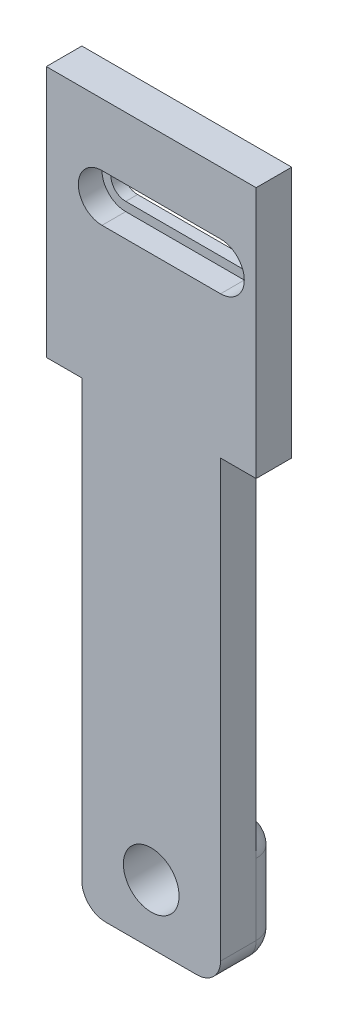
ISO-10303-21;
HEADER;
FILE_DESCRIPTION(('STEP AP214'),'2;1');
FILE_NAME('part.step','',(''),(''),'','','');
FILE_SCHEMA(('AUTOMOTIVE_DESIGN { 1 0 10303 214 1 1 1 1 }'));
ENDSEC;
DATA;
#1=APPLICATION_CONTEXT('core data for automotive mechanical design processes');
#2=APPLICATION_PROTOCOL_DEFINITION('international standard','automotive_design',2000,#1);
#3=PRODUCT_CONTEXT('',#1,'mechanical');
#4=PRODUCT('Part','Part','',(#3));
#5=PRODUCT_RELATED_PRODUCT_CATEGORY('part','',(#4));
#6=PRODUCT_DEFINITION_FORMATION('','',#4);
#7=PRODUCT_DEFINITION_CONTEXT('part definition',#1,'design');
#8=PRODUCT_DEFINITION('design','',#6,#7);
#9=PRODUCT_DEFINITION_SHAPE('','',#8);
#10=(LENGTH_UNIT() NAMED_UNIT(*) SI_UNIT(.MILLI.,.METRE.));
#11=(NAMED_UNIT(*) PLANE_ANGLE_UNIT() SI_UNIT($,.RADIAN.));
#12=(NAMED_UNIT(*) SI_UNIT($,.STERADIAN.) SOLID_ANGLE_UNIT());
#13=UNCERTAINTY_MEASURE_WITH_UNIT(LENGTH_MEASURE(1.E-05),#10,'distance_accuracy_value','');
#14=(GEOMETRIC_REPRESENTATION_CONTEXT(3) GLOBAL_UNCERTAINTY_ASSIGNED_CONTEXT((#13)) GLOBAL_UNIT_ASSIGNED_CONTEXT((#10,
#11,#12)) REPRESENTATION_CONTEXT('',''));
#15=CARTESIAN_POINT('',(0.,0.,0.));
#16=DIRECTION('',(0.,0.,1.));
#17=DIRECTION('',(1.,0.,0.));
#18=AXIS2_PLACEMENT_3D('',#15,#16,#17);
#19=CARTESIAN_POINT('',(0.,0.,0.));
#20=DIRECTION('',(0.,0.,1.));
#21=DIRECTION('',(1.,0.,0.));
#22=AXIS2_PLACEMENT_3D('',#19,#20,#21);
#23=PLANE('',#22);
#24=DIRECTION('',(1.,0.,0.));
#25=VECTOR('',#24,1.);
#26=CARTESIAN_POINT('',(-28.7142857142857,25.525974025974,0.));
#27=LINE('',#26,#25);
#28=CARTESIAN_POINT('',(-38.7142857142857,25.525974025974,0.));
#29=VERTEX_POINT('',#28);
#30=CARTESIAN_POINT('',(-28.7142857142857,25.525974025974,0.));
#31=VERTEX_POINT('',#30);
#32=EDGE_CURVE('E252',#29,#31,#27,.T.);
#33=ORIENTED_EDGE('',*,*,#32,.T.);
#34=CARTESIAN_POINT('',(-28.7142857142857,26.775974025974,0.));
#35=DIRECTION('',(0.,0.,1.));
#36=DIRECTION('',(1.,0.,0.));
#37=AXIS2_PLACEMENT_3D('',#34,#35,#36);
#38=CIRCLE('',#37,1.25);
#39=CARTESIAN_POINT('',(-28.7142857142857,28.025974025974,0.));
#40=VERTEX_POINT('',#39);
#41=EDGE_CURVE('E243',#31,#40,#38,.T.);
#42=ORIENTED_EDGE('',*,*,#41,.T.);
#43=DIRECTION('',(-1.,0.,0.));
#44=VECTOR('',#43,1.);
#45=CARTESIAN_POINT('',(-28.7142857142857,28.025974025974,0.));
#46=LINE('',#45,#44);
#47=CARTESIAN_POINT('',(-38.7142857142857,28.025974025974,0.));
#48=VERTEX_POINT('',#47);
#49=EDGE_CURVE('E246',#40,#48,#46,.T.);
#50=ORIENTED_EDGE('',*,*,#49,.T.);
#51=CARTESIAN_POINT('',(-38.7142857142857,26.775974025974,0.));
#52=DIRECTION('',(0.,0.,1.));
#53=DIRECTION('',(1.,0.,0.));
#54=AXIS2_PLACEMENT_3D('',#51,#52,#53);
#55=CIRCLE('',#54,1.25);
#56=EDGE_CURVE('E249',#48,#29,#55,.T.);
#57=ORIENTED_EDGE('',*,*,#56,.T.);
#58=EDGE_LOOP('',(#33,#42,#50,#57));
#59=FACE_BOUND('',#58,.T.);
#60=DIRECTION('',(1.,0.,0.));
#61=VECTOR('',#60,1.);
#62=CARTESIAN_POINT('',(-28.7142857142857,-15.974025974026,0.));
#63=LINE('',#62,#61);
#64=CARTESIAN_POINT('',(-38.4142857142857,-15.974025974026,0.));
#65=VERTEX_POINT('',#64);
#66=CARTESIAN_POINT('',(-30.7142857142857,-15.974025974026,0.));
#67=VERTEX_POINT('',#66);
#68=EDGE_CURVE('E222',#65,#67,#63,.T.);
#69=ORIENTED_EDGE('',*,*,#68,.F.);
#70=CARTESIAN_POINT('',(-38.4142857142857,-17.974025974026,0.));
#71=DIRECTION('',(0.,0.,1.));
#72=DIRECTION('',(1.,0.,0.));
#73=AXIS2_PLACEMENT_3D('',#70,#71,#72);
#74=CIRCLE('',#73,2.);
#75=CARTESIAN_POINT('',(-40.4142857142857,-17.974025974026,0.));
#76=VERTEX_POINT('',#75);
#77=EDGE_CURVE('E11',#65,#76,#74,.T.);
#78=ORIENTED_EDGE('',*,*,#77,.T.);
#79=DIRECTION('',(0.,1.,0.));
#80=VECTOR('',#79,1.);
#81=CARTESIAN_POINT('',(-40.4142857142857,-25.974025974026,0.));
#82=LINE('',#81,#80);
#83=CARTESIAN_POINT('',(-40.4142857142857,12.775974025974,0.));
#84=VERTEX_POINT('',#83);
#85=EDGE_CURVE('E268',#76,#84,#82,.T.);
#86=ORIENTED_EDGE('',*,*,#85,.T.);
#87=DIRECTION('',(-1.,0.,0.));
#88=VECTOR('',#87,1.);
#89=CARTESIAN_POINT('',(-43.4142857142857,12.775974025974,0.));
#90=LINE('',#89,#88);
#91=CARTESIAN_POINT('',(-43.4142857142857,12.775974025974,0.));
#92=VERTEX_POINT('',#91);
#93=EDGE_CURVE('E270',#84,#92,#90,.T.);
#94=ORIENTED_EDGE('',*,*,#93,.T.);
#95=DIRECTION('',(0.,-1.,0.));
#96=VECTOR('',#95,1.);
#97=CARTESIAN_POINT('',(-43.4142857142857,34.025974025974,0.));
#98=LINE('',#97,#96);
#99=CARTESIAN_POINT('',(-43.4142857142857,34.025974025974,0.));
#100=VERTEX_POINT('',#99);
#101=EDGE_CURVE('E282',#100,#92,#98,.T.);
#102=ORIENTED_EDGE('',*,*,#101,.F.);
#103=DIRECTION('',(-1.,0.,0.));
#104=VECTOR('',#103,1.);
#105=CARTESIAN_POINT('',(-43.4142857142857,34.025974025974,0.));
#106=LINE('',#105,#104);
#107=CARTESIAN_POINT('',(-25.7142857142857,34.025974025974,0.));
#108=VERTEX_POINT('',#107);
#109=EDGE_CURVE('E302',#108,#100,#106,.T.);
#110=ORIENTED_EDGE('',*,*,#109,.F.);
#111=DIRECTION('',(0.,1.,0.));
#112=VECTOR('',#111,1.);
#113=CARTESIAN_POINT('',(-25.7142857142857,34.025974025974,0.));
#114=LINE('',#113,#112);
#115=CARTESIAN_POINT('',(-25.7142857142857,12.775974025974,0.));
#116=VERTEX_POINT('',#115);
#117=EDGE_CURVE('E311',#116,#108,#114,.T.);
#118=ORIENTED_EDGE('',*,*,#117,.F.);
#119=DIRECTION('',(-1.,0.,0.));
#120=VECTOR('',#119,1.);
#121=CARTESIAN_POINT('',(-25.7142857142857,12.775974025974,0.));
#122=LINE('',#121,#120);
#123=CARTESIAN_POINT('',(-28.7142857142857,12.775974025974,0.));
#124=VERTEX_POINT('',#123);
#125=EDGE_CURVE('E292',#116,#124,#122,.T.);
#126=ORIENTED_EDGE('',*,*,#125,.T.);
#127=DIRECTION('',(0.,-1.,0.));
#128=VECTOR('',#127,1.);
#129=CARTESIAN_POINT('',(-28.7142857142857,-25.974025974026,0.));
#130=LINE('',#129,#128);
#131=CARTESIAN_POINT('',(-28.7142857142857,-17.974025974026,0.));
#132=VERTEX_POINT('',#131);
#133=EDGE_CURVE('E287',#124,#132,#130,.T.);
#134=ORIENTED_EDGE('',*,*,#133,.T.);
#135=CARTESIAN_POINT('',(-30.7142857142857,-17.974025974026,0.));
#136=DIRECTION('',(0.,0.,1.));
#137=DIRECTION('',(1.,0.,0.));
#138=AXIS2_PLACEMENT_3D('',#135,#136,#137);
#139=CIRCLE('',#138,2.);
#140=EDGE_CURVE('E350',#132,#67,#139,.T.);
#141=ORIENTED_EDGE('',*,*,#140,.T.);
#142=EDGE_LOOP('',(#69,#78,#86,#94,#102,#110,#118,#126,#134,#141));
#143=FACE_BOUND('',#142,.T.);
#144=ADVANCED_FACE('F40',(#59,#143),#23,.F.);
#145=CARTESIAN_POINT('',(-28.7142857142857,26.775974025974,0.));
#146=DIRECTION('',(0.,0.,1.));
#147=DIRECTION('',(1.,0.,0.));
#148=AXIS2_PLACEMENT_3D('',#145,#146,#147);
#149=CYLINDRICAL_SURFACE('',#148,1.25);
#150=CARTESIAN_POINT('',(-28.7142857142857,26.775974025974,1.));
#151=DIRECTION('',(0.,0.,1.));
#152=DIRECTION('',(1.,0.,0.));
#153=AXIS2_PLACEMENT_3D('',#150,#151,#152);
#154=CIRCLE('',#153,1.25);
#155=CARTESIAN_POINT('',(-28.7142857142857,28.025974025974,1.));
#156=VERTEX_POINT('',#155);
#157=CARTESIAN_POINT('',(-28.7142857142857,25.525974025974,1.));
#158=VERTEX_POINT('',#157);
#159=EDGE_CURVE('E241',#156,#158,#154,.F.);
#160=ORIENTED_EDGE('',*,*,#159,.F.);
#161=DIRECTION('',(0.,0.,1.));
#162=VECTOR('',#161,1.);
#163=CARTESIAN_POINT('',(-28.7142857142857,28.025974025974,0.));
#164=LINE('',#163,#162);
#165=EDGE_CURVE('E255',#40,#156,#164,.T.);
#166=ORIENTED_EDGE('',*,*,#165,.F.);
#167=ORIENTED_EDGE('',*,*,#41,.F.);
#168=DIRECTION('',(0.,0.,1.));
#169=VECTOR('',#168,1.);
#170=CARTESIAN_POINT('',(-28.7142857142857,25.525974025974,0.));
#171=LINE('',#170,#169);
#172=EDGE_CURVE('E256',#31,#158,#171,.T.);
#173=ORIENTED_EDGE('',*,*,#172,.T.);
#174=EDGE_LOOP('',(#160,#166,#167,#173));
#175=FACE_BOUND('',#174,.T.);
#176=ADVANCED_FACE('F467',(#175),#149,.F.);
#177=CARTESIAN_POINT('',(-28.7142857142857,25.525974025974,0.));
#178=DIRECTION('',(0.,-1.,0.));
#179=DIRECTION('',(0.,0.,-1.));
#180=AXIS2_PLACEMENT_3D('',#177,#178,#179);
#181=PLANE('',#180);
#182=DIRECTION('',(-1.,0.,0.));
#183=VECTOR('',#182,1.);
#184=CARTESIAN_POINT('',(-28.7142857142857,25.525974025974,1.));
#185=LINE('',#184,#183);
#186=CARTESIAN_POINT('',(-38.7142857142857,25.525974025974,1.));
#187=VERTEX_POINT('',#186);
#188=EDGE_CURVE('E239',#158,#187,#185,.T.);
#189=ORIENTED_EDGE('',*,*,#188,.F.);
#190=ORIENTED_EDGE('',*,*,#172,.F.);
#191=ORIENTED_EDGE('',*,*,#32,.F.);
#192=DIRECTION('',(0.,0.,1.));
#193=VECTOR('',#192,1.);
#194=CARTESIAN_POINT('',(-38.7142857142857,25.525974025974,0.));
#195=LINE('',#194,#193);
#196=EDGE_CURVE('E260',#29,#187,#195,.T.);
#197=ORIENTED_EDGE('',*,*,#196,.T.);
#198=EDGE_LOOP('',(#189,#190,#191,#197));
#199=FACE_BOUND('',#198,.T.);
#200=ADVANCED_FACE('F474',(#199),#181,.F.);
#201=CARTESIAN_POINT('',(-38.7142857142857,26.775974025974,0.));
#202=DIRECTION('',(0.,0.,1.));
#203=DIRECTION('',(1.,0.,0.));
#204=AXIS2_PLACEMENT_3D('',#201,#202,#203);
#205=CYLINDRICAL_SURFACE('',#204,1.25);
#206=CARTESIAN_POINT('',(-38.7142857142857,26.775974025974,1.));
#207=DIRECTION('',(0.,0.,1.));
#208=DIRECTION('',(1.,0.,0.));
#209=AXIS2_PLACEMENT_3D('',#206,#207,#208);
#210=CIRCLE('',#209,1.25);
#211=CARTESIAN_POINT('',(-38.7142857142857,28.025974025974,1.));
#212=VERTEX_POINT('',#211);
#213=EDGE_CURVE('E234',#187,#212,#210,.F.);
#214=ORIENTED_EDGE('',*,*,#213,.F.);
#215=ORIENTED_EDGE('',*,*,#196,.F.);
#216=ORIENTED_EDGE('',*,*,#56,.F.);
#217=DIRECTION('',(0.,0.,1.));
#218=VECTOR('',#217,1.);
#219=CARTESIAN_POINT('',(-38.7142857142857,28.025974025974,0.));
#220=LINE('',#219,#218);
#221=EDGE_CURVE('E263',#48,#212,#220,.T.);
#222=ORIENTED_EDGE('',*,*,#221,.T.);
#223=EDGE_LOOP('',(#214,#215,#216,#222));
#224=FACE_BOUND('',#223,.T.);
#225=ADVANCED_FACE('F489',(#224),#205,.F.);
#226=CARTESIAN_POINT('',(-28.7142857142857,28.025974025974,0.));
#227=DIRECTION('',(0.,1.,0.));
#228=DIRECTION('',(-1.,0.,0.));
#229=AXIS2_PLACEMENT_3D('',#226,#227,#228);
#230=PLANE('',#229);
#231=DIRECTION('',(1.,0.,0.));
#232=VECTOR('',#231,1.);
#233=CARTESIAN_POINT('',(-28.7142857142857,28.025974025974,1.));
#234=LINE('',#233,#232);
#235=EDGE_CURVE('E319',#212,#156,#234,.T.);
#236=ORIENTED_EDGE('',*,*,#235,.F.);
#237=ORIENTED_EDGE('',*,*,#221,.F.);
#238=ORIENTED_EDGE('',*,*,#49,.F.);
#239=ORIENTED_EDGE('',*,*,#165,.T.);
#240=EDGE_LOOP('',(#236,#237,#238,#239));
#241=FACE_BOUND('',#240,.T.);
#242=ADVANCED_FACE('F486',(#241),#230,.F.);
#243=CARTESIAN_POINT('',(-43.4142857142857,34.025974025974,3.));
#244=DIRECTION('',(1.,0.,0.));
#245=DIRECTION('',(0.,1.,0.));
#246=AXIS2_PLACEMENT_3D('',#243,#244,#245);
#247=PLANE('',#246);
#248=ORIENTED_EDGE('',*,*,#101,.T.);
#249=DIRECTION('',(0.,0.,1.));
#250=VECTOR('',#249,1.);
#251=CARTESIAN_POINT('',(-43.4142857142857,12.775974025974,0.));
#252=LINE('',#251,#250);
#253=CARTESIAN_POINT('',(-43.4142857142857,12.775974025974,3.));
#254=VERTEX_POINT('',#253);
#255=EDGE_CURVE('E279',#92,#254,#252,.T.);
#256=ORIENTED_EDGE('',*,*,#255,.T.);
#257=DIRECTION('',(0.,-1.,0.));
#258=VECTOR('',#257,1.);
#259=CARTESIAN_POINT('',(-43.4142857142857,34.025974025974,3.));
#260=LINE('',#259,#258);
#261=CARTESIAN_POINT('',(-43.4142857142857,34.025974025974,3.));
#262=VERTEX_POINT('',#261);
#263=EDGE_CURVE('E298',#262,#254,#260,.T.);
#264=ORIENTED_EDGE('',*,*,#263,.F.);
#265=DIRECTION('',(0.,0.,-1.));
#266=VECTOR('',#265,1.);
#267=CARTESIAN_POINT('',(-43.4142857142857,34.025974025974,3.));
#268=LINE('',#267,#266);
#269=EDGE_CURVE('E308',#262,#100,#268,.T.);
#270=ORIENTED_EDGE('',*,*,#269,.T.);
#271=EDGE_LOOP('',(#248,#256,#264,#270));
#272=FACE_BOUND('',#271,.T.);
#273=ADVANCED_FACE('F400',(#272),#247,.F.);
#274=CARTESIAN_POINT('',(-43.4142857142857,-25.974025974026,3.));
#275=DIRECTION('',(0.,1.,0.));
#276=DIRECTION('',(0.,0.,1.));
#277=AXIS2_PLACEMENT_3D('',#274,#275,#276);
#278=PLANE('',#277);
#279=DIRECTION('',(1.,0.,0.));
#280=VECTOR('',#279,1.);
#281=CARTESIAN_POINT('',(-43.4142857142857,-25.974025974026,3.));
#282=LINE('',#281,#280);
#283=CARTESIAN_POINT('',(-38.4142857142857,-25.974025974026,3.));
#284=VERTEX_POINT('',#283);
#285=CARTESIAN_POINT('',(-30.7142857142857,-25.974025974026,3.));
#286=VERTEX_POINT('',#285);
#287=EDGE_CURVE('E301',#284,#286,#282,.T.);
#288=ORIENTED_EDGE('',*,*,#287,.F.);
#289=DIRECTION('',(0.,0.,1.));
#290=VECTOR('',#289,1.);
#291=CARTESIAN_POINT('',(-38.4142857142857,-25.974025974026,3.));
#292=LINE('',#291,#290);
#293=CARTESIAN_POINT('',(-38.4142857142857,-25.974025974026,0.));
#294=VERTEX_POINT('',#293);
#295=EDGE_CURVE('E49',#284,#294,#292,.F.);
#296=ORIENTED_EDGE('',*,*,#295,.T.);
#297=DIRECTION('',(-1.,0.,0.));
#298=VECTOR('',#297,1.);
#299=CARTESIAN_POINT('',(-43.4142857142857,-25.974025974026,0.));
#300=LINE('',#299,#298);
#301=CARTESIAN_POINT('',(-30.7142857142857,-25.974025974026,0.));
#302=VERTEX_POINT('',#301);
#303=EDGE_CURVE('E328',#294,#302,#300,.F.);
#304=ORIENTED_EDGE('',*,*,#303,.T.);
#305=DIRECTION('',(0.,0.,1.));
#306=VECTOR('',#305,1.);
#307=CARTESIAN_POINT('',(-30.7142857142857,-25.974025974026,3.));
#308=LINE('',#307,#306);
#309=EDGE_CURVE('E345',#302,#286,#308,.T.);
#310=ORIENTED_EDGE('',*,*,#309,.T.);
#311=EDGE_LOOP('',(#288,#296,#304,#310));
#312=FACE_BOUND('',#311,.T.);
#313=ADVANCED_FACE('F439',(#312),#278,.F.);
#314=CARTESIAN_POINT('',(-25.7142857142857,34.025974025974,3.));
#315=DIRECTION('',(-1.,0.,0.));
#316=DIRECTION('',(0.,-1.,0.));
#317=AXIS2_PLACEMENT_3D('',#314,#315,#316);
#318=PLANE('',#317);
#319=DIRECTION('',(0.,1.,0.));
#320=VECTOR('',#319,1.);
#321=CARTESIAN_POINT('',(-25.7142857142857,34.025974025974,3.));
#322=LINE('',#321,#320);
#323=CARTESIAN_POINT('',(-25.7142857142857,12.775974025974,3.));
#324=VERTEX_POINT('',#323);
#325=CARTESIAN_POINT('',(-25.7142857142857,34.025974025974,3.));
#326=VERTEX_POINT('',#325);
#327=EDGE_CURVE('E304',#324,#326,#322,.T.);
#328=ORIENTED_EDGE('',*,*,#327,.F.);
#329=DIRECTION('',(0.,0.,1.));
#330=VECTOR('',#329,1.);
#331=CARTESIAN_POINT('',(-25.7142857142857,12.775974025974,0.));
#332=LINE('',#331,#330);
#333=EDGE_CURVE('E285',#116,#324,#332,.T.);
#334=ORIENTED_EDGE('',*,*,#333,.F.);
#335=ORIENTED_EDGE('',*,*,#117,.T.);
#336=DIRECTION('',(0.,0.,-1.));
#337=VECTOR('',#336,1.);
#338=CARTESIAN_POINT('',(-25.7142857142857,34.025974025974,3.));
#339=LINE('',#338,#337);
#340=EDGE_CURVE('E316',#326,#108,#339,.T.);
#341=ORIENTED_EDGE('',*,*,#340,.F.);
#342=EDGE_LOOP('',(#328,#334,#335,#341));
#343=FACE_BOUND('',#342,.T.);
#344=ADVANCED_FACE('F451',(#343),#318,.F.);
#345=CARTESIAN_POINT('',(-43.4142857142857,34.025974025974,3.));
#346=DIRECTION('',(0.,-1.,0.));
#347=DIRECTION('',(0.,0.,-1.));
#348=AXIS2_PLACEMENT_3D('',#345,#346,#347);
#349=PLANE('',#348);
#350=ORIENTED_EDGE('',*,*,#109,.T.);
#351=ORIENTED_EDGE('',*,*,#269,.F.);
#352=DIRECTION('',(-1.,0.,0.));
#353=VECTOR('',#352,1.);
#354=CARTESIAN_POINT('',(-43.4142857142857,34.025974025974,3.));
#355=LINE('',#354,#353);
#356=EDGE_CURVE('E306',#326,#262,#355,.T.);
#357=ORIENTED_EDGE('',*,*,#356,.F.);
#358=ORIENTED_EDGE('',*,*,#340,.T.);
#359=EDGE_LOOP('',(#350,#351,#357,#358));
#360=FACE_BOUND('',#359,.T.);
#361=ADVANCED_FACE('F454',(#360),#349,.F.);
#362=CARTESIAN_POINT('',(0.,0.,3.));
#363=DIRECTION('',(0.,0.,1.));
#364=DIRECTION('',(1.,0.,0.));
#365=AXIS2_PLACEMENT_3D('',#362,#363,#364);
#366=PLANE('',#365);
#367=CARTESIAN_POINT('',(-34.5642857142857,-20.974025974026,3.));
#368=DIRECTION('',(0.,0.,-1.));
#369=DIRECTION('',(-1.,0.,0.));
#370=AXIS2_PLACEMENT_3D('',#367,#368,#369);
#371=CIRCLE('',#370,2.35);
#372=CARTESIAN_POINT('',(-36.9142857142857,-20.974025974026,3.));
#373=VERTEX_POINT('',#372);
#374=EDGE_CURVE('E325',#373,#373,#371,.T.);
#375=ORIENTED_EDGE('',*,*,#374,.T.);
#376=EDGE_LOOP('',(#375));
#377=FACE_BOUND('',#376,.T.);
#378=CARTESIAN_POINT('',(-38.7142857142857,26.775974025974,3.));
#379=DIRECTION('',(0.,0.,1.));
#380=DIRECTION('',(1.,0.,0.));
#381=AXIS2_PLACEMENT_3D('',#378,#379,#380);
#382=CIRCLE('',#381,2.);
#383=CARTESIAN_POINT('',(-38.7142857142857,28.775974025974,3.));
#384=VERTEX_POINT('',#383);
#385=CARTESIAN_POINT('',(-38.7142857142857,24.775974025974,3.));
#386=VERTEX_POINT('',#385);
#387=EDGE_CURVE('E198',#384,#386,#382,.T.);
#388=ORIENTED_EDGE('',*,*,#387,.F.);
#389=DIRECTION('',(-1.,0.,0.));
#390=VECTOR('',#389,1.);
#391=CARTESIAN_POINT('',(-38.7142857142857,28.775974025974,3.));
#392=LINE('',#391,#390);
#393=CARTESIAN_POINT('',(-28.7142857142857,28.775974025974,3.));
#394=VERTEX_POINT('',#393);
#395=EDGE_CURVE('E216',#394,#384,#392,.T.);
#396=ORIENTED_EDGE('',*,*,#395,.F.);
#397=CARTESIAN_POINT('',(-28.7142857142857,26.775974025974,3.));
#398=DIRECTION('',(0.,0.,1.));
#399=DIRECTION('',(1.,0.,0.));
#400=AXIS2_PLACEMENT_3D('',#397,#398,#399);
#401=CIRCLE('',#400,2.);
#402=CARTESIAN_POINT('',(-28.7142857142857,24.775974025974,3.));
#403=VERTEX_POINT('',#402);
#404=EDGE_CURVE('E219',#403,#394,#401,.T.);
#405=ORIENTED_EDGE('',*,*,#404,.F.);
#406=DIRECTION('',(1.,0.,0.));
#407=VECTOR('',#406,1.);
#408=CARTESIAN_POINT('',(-38.7142857142857,24.775974025974,3.));
#409=LINE('',#408,#407);
#410=EDGE_CURVE('E228',#386,#403,#409,.T.);
#411=ORIENTED_EDGE('',*,*,#410,.F.);
#412=EDGE_LOOP('',(#388,#396,#405,#411));
#413=FACE_BOUND('',#412,.T.);
#414=DIRECTION('',(0.,1.,0.));
#415=VECTOR('',#414,1.);
#416=CARTESIAN_POINT('',(-40.4142857142857,-25.974025974026,3.));
#417=LINE('',#416,#415);
#418=CARTESIAN_POINT('',(-40.4142857142857,-23.974025974026,3.));
#419=VERTEX_POINT('',#418);
#420=CARTESIAN_POINT('',(-40.4142857142857,12.775974025974,3.));
#421=VERTEX_POINT('',#420);
#422=EDGE_CURVE('E275',#419,#421,#417,.T.);
#423=ORIENTED_EDGE('',*,*,#422,.F.);
#424=CARTESIAN_POINT('',(-38.4142857142857,-23.974025974026,3.));
#425=DIRECTION('',(0.,0.,1.));
#426=DIRECTION('',(1.,0.,0.));
#427=AXIS2_PLACEMENT_3D('',#424,#425,#426);
#428=CIRCLE('',#427,2.);
#429=EDGE_CURVE('E57',#419,#284,#428,.T.);
#430=ORIENTED_EDGE('',*,*,#429,.T.);
#431=ORIENTED_EDGE('',*,*,#287,.T.);
#432=CARTESIAN_POINT('',(-30.7142857142857,-23.974025974026,3.));
#433=DIRECTION('',(0.,0.,1.));
#434=DIRECTION('',(1.,0.,0.));
#435=AXIS2_PLACEMENT_3D('',#432,#433,#434);
#436=CIRCLE('',#435,2.);
#437=CARTESIAN_POINT('',(-28.7142857142857,-23.974025974026,3.));
#438=VERTEX_POINT('',#437);
#439=EDGE_CURVE('E348',#286,#438,#436,.T.);
#440=ORIENTED_EDGE('',*,*,#439,.T.);
#441=DIRECTION('',(0.,-1.,0.));
#442=VECTOR('',#441,1.);
#443=CARTESIAN_POINT('',(-28.7142857142857,-25.974025974026,3.));
#444=LINE('',#443,#442);
#445=CARTESIAN_POINT('',(-28.7142857142857,12.775974025974,3.));
#446=VERTEX_POINT('',#445);
#447=EDGE_CURVE('E289',#446,#438,#444,.T.);
#448=ORIENTED_EDGE('',*,*,#447,.F.);
#449=DIRECTION('',(-1.,0.,0.));
#450=VECTOR('',#449,1.);
#451=CARTESIAN_POINT('',(-25.7142857142857,12.775974025974,3.));
#452=LINE('',#451,#450);
#453=EDGE_CURVE('E277',#324,#446,#452,.T.);
#454=ORIENTED_EDGE('',*,*,#453,.F.);
#455=ORIENTED_EDGE('',*,*,#327,.T.);
#456=ORIENTED_EDGE('',*,*,#356,.T.);
#457=ORIENTED_EDGE('',*,*,#263,.T.);
#458=DIRECTION('',(-1.,0.,0.));
#459=VECTOR('',#458,1.);
#460=CARTESIAN_POINT('',(-43.4142857142857,12.775974025974,3.));
#461=LINE('',#460,#459);
#462=EDGE_CURVE('E271',#421,#254,#461,.T.);
#463=ORIENTED_EDGE('',*,*,#462,.F.);
#464=EDGE_LOOP('',(#423,#430,#431,#440,#448,#454,#455,#456,#457,#463));
#465=FACE_BOUND('',#464,.T.);
#466=ADVANCED_FACE('F394',(#377,#413,#465),#366,.T.);
#467=CARTESIAN_POINT('',(-28.7142857142857,-25.974025974026,0.));
#468=DIRECTION('',(-1.,0.,0.));
#469=DIRECTION('',(0.,0.,1.));
#470=AXIS2_PLACEMENT_3D('',#467,#468,#469);
#471=PLANE('',#470);
#472=DIRECTION('',(0.,-1.,0.));
#473=VECTOR('',#472,1.);
#474=CARTESIAN_POINT('',(-28.7142857142857,-25.974025974026,0.));
#475=LINE('',#474,#473);
#476=CARTESIAN_POINT('',(-28.7142857142857,-23.974025974026,0.));
#477=VERTEX_POINT('',#476);
#478=EDGE_CURVE('E334',#477,#132,#475,.F.);
#479=ORIENTED_EDGE('',*,*,#478,.T.);
#480=ORIENTED_EDGE('',*,*,#133,.F.);
#481=DIRECTION('',(0.,0.,1.));
#482=VECTOR('',#481,1.);
#483=CARTESIAN_POINT('',(-28.7142857142857,12.775974025974,0.));
#484=LINE('',#483,#482);
#485=EDGE_CURVE('E259',#124,#446,#484,.T.);
#486=ORIENTED_EDGE('',*,*,#485,.T.);
#487=ORIENTED_EDGE('',*,*,#447,.T.);
#488=DIRECTION('',(0.,0.,1.));
#489=VECTOR('',#488,1.);
#490=CARTESIAN_POINT('',(-28.7142857142857,-23.974025974026,0.));
#491=LINE('',#490,#489);
#492=EDGE_CURVE('E332',#438,#477,#491,.F.);
#493=ORIENTED_EDGE('',*,*,#492,.T.);
#494=EDGE_LOOP('',(#479,#480,#486,#487,#493));
#495=FACE_BOUND('',#494,.T.);
#496=ADVANCED_FACE('F443',(#495),#471,.F.);
#497=CARTESIAN_POINT('',(-25.7142857142857,12.775974025974,0.));
#498=DIRECTION('',(0.,1.,0.));
#499=DIRECTION('',(-1.,0.,0.));
#500=AXIS2_PLACEMENT_3D('',#497,#498,#499);
#501=PLANE('',#500);
#502=ORIENTED_EDGE('',*,*,#453,.T.);
#503=ORIENTED_EDGE('',*,*,#485,.F.);
#504=ORIENTED_EDGE('',*,*,#125,.F.);
#505=ORIENTED_EDGE('',*,*,#333,.T.);
#506=EDGE_LOOP('',(#502,#503,#504,#505));
#507=FACE_BOUND('',#506,.T.);
#508=ADVANCED_FACE('F446',(#507),#501,.F.);
#509=CARTESIAN_POINT('',(-43.4142857142857,12.775974025974,0.));
#510=DIRECTION('',(0.,1.,0.));
#511=DIRECTION('',(0.,0.,1.));
#512=AXIS2_PLACEMENT_3D('',#509,#510,#511);
#513=PLANE('',#512);
#514=ORIENTED_EDGE('',*,*,#462,.T.);
#515=ORIENTED_EDGE('',*,*,#255,.F.);
#516=ORIENTED_EDGE('',*,*,#93,.F.);
#517=DIRECTION('',(0.,0.,1.));
#518=VECTOR('',#517,1.);
#519=CARTESIAN_POINT('',(-40.4142857142857,12.775974025974,0.));
#520=LINE('',#519,#518);
#521=EDGE_CURVE('E274',#84,#421,#520,.T.);
#522=ORIENTED_EDGE('',*,*,#521,.T.);
#523=EDGE_LOOP('',(#514,#515,#516,#522));
#524=FACE_BOUND('',#523,.T.);
#525=ADVANCED_FACE('F397',(#524),#513,.F.);
#526=CARTESIAN_POINT('',(-40.4142857142857,-25.974025974026,0.));
#527=DIRECTION('',(1.,0.,0.));
#528=DIRECTION('',(0.,0.,-1.));
#529=AXIS2_PLACEMENT_3D('',#526,#527,#528);
#530=PLANE('',#529);
#531=ORIENTED_EDGE('',*,*,#85,.F.);
#532=DIRECTION('',(0.,1.,0.));
#533=VECTOR('',#532,1.);
#534=CARTESIAN_POINT('',(-40.4142857142857,-25.974025974026,0.));
#535=LINE('',#534,#533);
#536=CARTESIAN_POINT('',(-40.4142857142857,-23.974025974026,0.));
#537=VERTEX_POINT('',#536);
#538=EDGE_CURVE('E367',#76,#537,#535,.F.);
#539=ORIENTED_EDGE('',*,*,#538,.T.);
#540=DIRECTION('',(0.,0.,1.));
#541=VECTOR('',#540,1.);
#542=CARTESIAN_POINT('',(-40.4142857142857,-23.974025974026,0.));
#543=LINE('',#542,#541);
#544=EDGE_CURVE('E365',#537,#419,#543,.T.);
#545=ORIENTED_EDGE('',*,*,#544,.T.);
#546=ORIENTED_EDGE('',*,*,#422,.T.);
#547=ORIENTED_EDGE('',*,*,#521,.F.);
#548=EDGE_LOOP('',(#531,#539,#545,#546,#547));
#549=FACE_BOUND('',#548,.T.);
#550=ADVANCED_FACE('F391',(#549),#530,.F.);
#551=CARTESIAN_POINT('',(-38.7142857142857,26.775974025974,1.));
#552=DIRECTION('',(0.,0.,1.));
#553=DIRECTION('',(1.,0.,0.));
#554=AXIS2_PLACEMENT_3D('',#551,#552,#553);
#555=PLANE('',#554);
#556=CARTESIAN_POINT('',(-38.7142857142857,26.775974025974,1.));
#557=DIRECTION('',(0.,0.,1.));
#558=DIRECTION('',(1.,0.,0.));
#559=AXIS2_PLACEMENT_3D('',#556,#557,#558);
#560=CIRCLE('',#559,2.);
#561=CARTESIAN_POINT('',(-38.7142857142857,28.775974025974,1.));
#562=VERTEX_POINT('',#561);
#563=CARTESIAN_POINT('',(-38.7142857142857,24.775974025974,1.));
#564=VERTEX_POINT('',#563);
#565=EDGE_CURVE('E195',#562,#564,#560,.T.);
#566=ORIENTED_EDGE('',*,*,#565,.T.);
#567=DIRECTION('',(1.,0.,0.));
#568=VECTOR('',#567,1.);
#569=CARTESIAN_POINT('',(-38.7142857142857,24.775974025974,1.));
#570=LINE('',#569,#568);
#571=CARTESIAN_POINT('',(-28.7142857142857,24.775974025974,1.));
#572=VERTEX_POINT('',#571);
#573=EDGE_CURVE('E206',#564,#572,#570,.T.);
#574=ORIENTED_EDGE('',*,*,#573,.T.);
#575=CARTESIAN_POINT('',(-28.7142857142857,26.775974025974,1.));
#576=DIRECTION('',(0.,0.,1.));
#577=DIRECTION('',(1.,0.,0.));
#578=AXIS2_PLACEMENT_3D('',#575,#576,#577);
#579=CIRCLE('',#578,2.);
#580=CARTESIAN_POINT('',(-28.7142857142857,28.775974025974,1.));
#581=VERTEX_POINT('',#580);
#582=EDGE_CURVE('E211',#572,#581,#579,.T.);
#583=ORIENTED_EDGE('',*,*,#582,.T.);
#584=DIRECTION('',(-1.,0.,0.));
#585=VECTOR('',#584,1.);
#586=CARTESIAN_POINT('',(-38.7142857142857,28.775974025974,1.));
#587=LINE('',#586,#585);
#588=EDGE_CURVE('E203',#581,#562,#587,.T.);
#589=ORIENTED_EDGE('',*,*,#588,.T.);
#590=EDGE_LOOP('',(#566,#574,#583,#589));
#591=FACE_BOUND('',#590,.T.);
#592=ORIENTED_EDGE('',*,*,#159,.T.);
#593=ORIENTED_EDGE('',*,*,#188,.T.);
#594=ORIENTED_EDGE('',*,*,#213,.T.);
#595=ORIENTED_EDGE('',*,*,#235,.T.);
#596=EDGE_LOOP('',(#592,#593,#594,#595));
#597=FACE_BOUND('',#596,.T.);
#598=ADVANCED_FACE('F213',(#591,#597),#555,.T.);
#599=CARTESIAN_POINT('',(-38.7142857142857,26.775974025974,1.));
#600=DIRECTION('',(0.,0.,1.));
#601=DIRECTION('',(1.,0.,0.));
#602=AXIS2_PLACEMENT_3D('',#599,#600,#601);
#603=CYLINDRICAL_SURFACE('',#602,2.);
#604=ORIENTED_EDGE('',*,*,#387,.T.);
#605=DIRECTION('',(0.,0.,1.));
#606=VECTOR('',#605,1.);
#607=CARTESIAN_POINT('',(-38.7142857142857,24.775974025974,1.));
#608=LINE('',#607,#606);
#609=EDGE_CURVE('E191',#564,#386,#608,.T.);
#610=ORIENTED_EDGE('',*,*,#609,.F.);
#611=ORIENTED_EDGE('',*,*,#565,.F.);
#612=DIRECTION('',(0.,0.,1.));
#613=VECTOR('',#612,1.);
#614=CARTESIAN_POINT('',(-38.7142857142857,28.775974025974,1.));
#615=LINE('',#614,#613);
#616=EDGE_CURVE('E232',#562,#384,#615,.T.);
#617=ORIENTED_EDGE('',*,*,#616,.T.);
#618=EDGE_LOOP('',(#604,#610,#611,#617));
#619=FACE_BOUND('',#618,.T.);
#620=ADVANCED_FACE('F193',(#619),#603,.F.);
#621=CARTESIAN_POINT('',(-38.7142857142857,28.775974025974,1.));
#622=DIRECTION('',(0.,1.,0.));
#623=DIRECTION('',(0.,0.,1.));
#624=AXIS2_PLACEMENT_3D('',#621,#622,#623);
#625=PLANE('',#624);
#626=ORIENTED_EDGE('',*,*,#395,.T.);
#627=ORIENTED_EDGE('',*,*,#616,.F.);
#628=ORIENTED_EDGE('',*,*,#588,.F.);
#629=DIRECTION('',(0.,0.,1.));
#630=VECTOR('',#629,1.);
#631=CARTESIAN_POINT('',(-28.7142857142857,28.775974025974,1.));
#632=LINE('',#631,#630);
#633=EDGE_CURVE('E235',#581,#394,#632,.T.);
#634=ORIENTED_EDGE('',*,*,#633,.T.);
#635=EDGE_LOOP('',(#626,#627,#628,#634));
#636=FACE_BOUND('',#635,.T.);
#637=ADVANCED_FACE('F499',(#636),#625,.F.);
#638=CARTESIAN_POINT('',(-28.7142857142857,26.775974025974,1.));
#639=DIRECTION('',(0.,0.,1.));
#640=DIRECTION('',(1.,0.,0.));
#641=AXIS2_PLACEMENT_3D('',#638,#639,#640);
#642=CYLINDRICAL_SURFACE('',#641,2.);
#643=ORIENTED_EDGE('',*,*,#404,.T.);
#644=ORIENTED_EDGE('',*,*,#633,.F.);
#645=ORIENTED_EDGE('',*,*,#582,.F.);
#646=DIRECTION('',(0.,0.,1.));
#647=VECTOR('',#646,1.);
#648=CARTESIAN_POINT('',(-28.7142857142857,24.775974025974,1.));
#649=LINE('',#648,#647);
#650=EDGE_CURVE('E202',#572,#403,#649,.T.);
#651=ORIENTED_EDGE('',*,*,#650,.T.);
#652=EDGE_LOOP('',(#643,#644,#645,#651));
#653=FACE_BOUND('',#652,.T.);
#654=ADVANCED_FACE('F502',(#653),#642,.F.);
#655=CARTESIAN_POINT('',(-38.7142857142857,24.775974025974,1.));
#656=DIRECTION('',(0.,-1.,0.));
#657=DIRECTION('',(0.,0.,-1.));
#658=AXIS2_PLACEMENT_3D('',#655,#656,#657);
#659=PLANE('',#658);
#660=ORIENTED_EDGE('',*,*,#410,.T.);
#661=ORIENTED_EDGE('',*,*,#650,.F.);
#662=ORIENTED_EDGE('',*,*,#573,.F.);
#663=ORIENTED_EDGE('',*,*,#609,.T.);
#664=EDGE_LOOP('',(#660,#661,#662,#663));
#665=FACE_BOUND('',#664,.T.);
#666=ADVANCED_FACE('F207',(#665),#659,.F.);
#667=CARTESIAN_POINT('',(0.,0.,-2.));
#668=DIRECTION('',(0.,0.,1.));
#669=DIRECTION('',(1.,0.,0.));
#670=AXIS2_PLACEMENT_3D('',#667,#668,#669);
#671=PLANE('',#670);
#672=CARTESIAN_POINT('',(-34.5642857142857,-20.974025974026,-2.));
#673=DIRECTION('',(0.,0.,1.));
#674=DIRECTION('',(1.,0.,0.));
#675=AXIS2_PLACEMENT_3D('',#672,#673,#674);
#676=CIRCLE('',#675,2.35);
#677=CARTESIAN_POINT('',(-32.2142857142857,-20.974025974026,-2.));
#678=VERTEX_POINT('',#677);
#679=EDGE_CURVE('E322',#678,#678,#676,.T.);
#680=ORIENTED_EDGE('',*,*,#679,.T.);
#681=EDGE_LOOP('',(#680));
#682=FACE_BOUND('',#681,.T.);
#683=DIRECTION('',(-1.,0.,0.));
#684=VECTOR('',#683,1.);
#685=CARTESIAN_POINT('',(0.,-23.974025974026,-2.));
#686=LINE('',#685,#684);
#687=CARTESIAN_POINT('',(-30.7142857142857,-23.974025974026,-2.));
#688=VERTEX_POINT('',#687);
#689=CARTESIAN_POINT('',(-38.4142857142857,-23.974025974026,-2.));
#690=VERTEX_POINT('',#689);
#691=EDGE_CURVE('E321',#688,#690,#686,.T.);
#692=ORIENTED_EDGE('',*,*,#691,.T.);
#693=DIRECTION('',(0.,1.,0.));
#694=VECTOR('',#693,1.);
#695=CARTESIAN_POINT('',(-38.4142857142857,0.,-2.));
#696=LINE('',#695,#694);
#697=CARTESIAN_POINT('',(-38.4142857142857,-17.974025974026,-2.));
#698=VERTEX_POINT('',#697);
#699=EDGE_CURVE('E369',#690,#698,#696,.T.);
#700=ORIENTED_EDGE('',*,*,#699,.T.);
#701=DIRECTION('',(1.,0.,0.));
#702=VECTOR('',#701,1.);
#703=CARTESIAN_POINT('',(0.,-17.974025974026,-2.));
#704=LINE('',#703,#702);
#705=CARTESIAN_POINT('',(-30.7142857142857,-17.974025974026,-2.));
#706=VERTEX_POINT('',#705);
#707=EDGE_CURVE('E330',#698,#706,#704,.T.);
#708=ORIENTED_EDGE('',*,*,#707,.T.);
#709=DIRECTION('',(0.,-1.,0.));
#710=VECTOR('',#709,1.);
#711=CARTESIAN_POINT('',(-30.7142857142857,0.,-2.));
#712=LINE('',#711,#710);
#713=EDGE_CURVE('E340',#706,#688,#712,.T.);
#714=ORIENTED_EDGE('',*,*,#713,.T.);
#715=EDGE_LOOP('',(#692,#700,#708,#714));
#716=FACE_BOUND('',#715,.T.);
#717=ADVANCED_FACE('F417',(#682,#716),#671,.F.);
#718=CARTESIAN_POINT('',(-34.5642857142857,-20.974025974026,3.));
#719=DIRECTION('',(0.,0.,-1.));
#720=DIRECTION('',(-1.,0.,0.));
#721=AXIS2_PLACEMENT_3D('',#718,#719,#720);
#722=CYLINDRICAL_SURFACE('',#721,2.35);
#723=ORIENTED_EDGE('',*,*,#374,.F.);
#724=EDGE_LOOP('',(#723));
#725=FACE_BOUND('',#724,.T.);
#726=ORIENTED_EDGE('',*,*,#679,.F.);
#727=EDGE_LOOP('',(#726));
#728=FACE_BOUND('',#727,.T.);
#729=ADVANCED_FACE('F513',(#725,#728),#722,.F.);
#730=CARTESIAN_POINT('',(0.,-23.974025974026,0.));
#731=DIRECTION('',(-1.,0.,0.));
#732=DIRECTION('',(0.,0.,1.));
#733=AXIS2_PLACEMENT_3D('',#730,#731,#732);
#734=CYLINDRICAL_SURFACE('',#733,2.);
#735=ORIENTED_EDGE('',*,*,#303,.F.);
#736=CARTESIAN_POINT('',(-38.4142857142857,-23.974025974026,0.));
#737=DIRECTION('',(-1.,0.,0.));
#738=DIRECTION('',(0.,0.,1.));
#739=AXIS2_PLACEMENT_3D('',#736,#737,#738);
#740=CIRCLE('',#739,2.);
#741=EDGE_CURVE('E371',#294,#690,#740,.F.);
#742=ORIENTED_EDGE('',*,*,#741,.T.);
#743=ORIENTED_EDGE('',*,*,#691,.F.);
#744=CARTESIAN_POINT('',(-30.7142857142857,-23.974025974026,0.));
#745=DIRECTION('',(-1.,0.,0.));
#746=DIRECTION('',(0.,0.,1.));
#747=AXIS2_PLACEMENT_3D('',#744,#745,#746);
#748=CIRCLE('',#747,2.);
#749=EDGE_CURVE('E342',#688,#302,#748,.T.);
#750=ORIENTED_EDGE('',*,*,#749,.T.);
#751=EDGE_LOOP('',(#735,#742,#743,#750));
#752=FACE_BOUND('',#751,.T.);
#753=ADVANCED_FACE('F434',(#752),#734,.T.);
#754=CARTESIAN_POINT('',(0.,-17.974025974026,0.));
#755=DIRECTION('',(1.,0.,0.));
#756=DIRECTION('',(0.,0.,-1.));
#757=AXIS2_PLACEMENT_3D('',#754,#755,#756);
#758=CYLINDRICAL_SURFACE('',#757,2.);
#759=ORIENTED_EDGE('',*,*,#707,.F.);
#760=CARTESIAN_POINT('',(-38.4142857142857,-17.974025974026,0.));
#761=DIRECTION('',(1.,0.,0.));
#762=DIRECTION('',(0.,0.,-1.));
#763=AXIS2_PLACEMENT_3D('',#760,#761,#762);
#764=CIRCLE('',#763,2.);
#765=EDGE_CURVE('E353',#698,#65,#764,.T.);
#766=ORIENTED_EDGE('',*,*,#765,.T.);
#767=ORIENTED_EDGE('',*,*,#68,.T.);
#768=CARTESIAN_POINT('',(-30.7142857142857,-17.974025974026,0.));
#769=DIRECTION('',(1.,0.,0.));
#770=DIRECTION('',(0.,0.,-1.));
#771=AXIS2_PLACEMENT_3D('',#768,#769,#770);
#772=CIRCLE('',#771,2.);
#773=EDGE_CURVE('E337',#67,#706,#772,.F.);
#774=ORIENTED_EDGE('',*,*,#773,.T.);
#775=EDGE_LOOP('',(#759,#766,#767,#774));
#776=FACE_BOUND('',#775,.T.);
#777=ADVANCED_FACE('F414',(#776),#758,.T.);
#778=CARTESIAN_POINT('',(-30.7142857142857,-23.974025974026,3.));
#779=DIRECTION('',(0.,0.,1.));
#780=DIRECTION('',(1.,0.,0.));
#781=AXIS2_PLACEMENT_3D('',#778,#779,#780);
#782=CYLINDRICAL_SURFACE('',#781,2.);
#783=ORIENTED_EDGE('',*,*,#439,.F.);
#784=ORIENTED_EDGE('',*,*,#309,.F.);
#785=CARTESIAN_POINT('',(-30.7142857142857,-23.974025974026,0.));
#786=DIRECTION('',(0.,0.,-1.));
#787=DIRECTION('',(-1.,0.,0.));
#788=AXIS2_PLACEMENT_3D('',#785,#786,#787);
#789=CIRCLE('',#788,2.);
#790=EDGE_CURVE('E360',#477,#302,#789,.T.);
#791=ORIENTED_EDGE('',*,*,#790,.F.);
#792=ORIENTED_EDGE('',*,*,#492,.F.);
#793=EDGE_LOOP('',(#783,#784,#791,#792));
#794=FACE_BOUND('',#793,.T.);
#795=ADVANCED_FACE('F437',(#794),#782,.T.);
#796=CARTESIAN_POINT('',(-30.7142857142857,-23.974025974026,0.));
#797=DIRECTION('',(-1.,0.,0.));
#798=DIRECTION('',(0.,0.,1.));
#799=AXIS2_PLACEMENT_3D('',#796,#797,#798);
#800=SPHERICAL_SURFACE('',#799,2.);
#801=ORIENTED_EDGE('',*,*,#790,.T.);
#802=ORIENTED_EDGE('',*,*,#749,.F.);
#803=CARTESIAN_POINT('',(-30.7142857142857,-23.974025974026,0.));
#804=DIRECTION('',(0.,1.,0.));
#805=DIRECTION('',(0.,0.,1.));
#806=AXIS2_PLACEMENT_3D('',#803,#804,#805);
#807=CIRCLE('',#806,2.);
#808=EDGE_CURVE('E357',#477,#688,#807,.T.);
#809=ORIENTED_EDGE('',*,*,#808,.F.);
#810=EDGE_LOOP('',(#801,#802,#809));
#811=FACE_BOUND('',#810,.T.);
#812=ADVANCED_FACE('F430',(#811),#800,.T.);
#813=CARTESIAN_POINT('',(-30.7142857142857,0.,0.));
#814=DIRECTION('',(0.,-1.,0.));
#815=DIRECTION('',(0.,0.,-1.));
#816=AXIS2_PLACEMENT_3D('',#813,#814,#815);
#817=CYLINDRICAL_SURFACE('',#816,2.);
#818=ORIENTED_EDGE('',*,*,#808,.T.);
#819=ORIENTED_EDGE('',*,*,#713,.F.);
#820=CARTESIAN_POINT('',(-30.7142857142857,-17.974025974026,0.));
#821=DIRECTION('',(0.,1.,0.));
#822=DIRECTION('',(0.,0.,1.));
#823=AXIS2_PLACEMENT_3D('',#820,#821,#822);
#824=CIRCLE('',#823,2.);
#825=EDGE_CURVE('E354',#132,#706,#824,.T.);
#826=ORIENTED_EDGE('',*,*,#825,.F.);
#827=ORIENTED_EDGE('',*,*,#478,.F.);
#828=EDGE_LOOP('',(#818,#819,#826,#827));
#829=FACE_BOUND('',#828,.T.);
#830=ADVANCED_FACE('F426',(#829),#817,.T.);
#831=CARTESIAN_POINT('',(-30.7142857142857,-17.974025974026,0.));
#832=DIRECTION('',(-1.,0.,0.));
#833=DIRECTION('',(0.,0.,1.));
#834=AXIS2_PLACEMENT_3D('',#831,#832,#833);
#835=SPHERICAL_SURFACE('',#834,2.);
#836=ORIENTED_EDGE('',*,*,#825,.T.);
#837=ORIENTED_EDGE('',*,*,#773,.F.);
#838=ORIENTED_EDGE('',*,*,#140,.F.);
#839=EDGE_LOOP('',(#836,#837,#838));
#840=FACE_BOUND('',#839,.T.);
#841=ADVANCED_FACE('F423',(#840),#835,.T.);
#842=CARTESIAN_POINT('',(-38.4142857142857,-23.974025974026,0.));
#843=DIRECTION('',(0.,0.,1.));
#844=DIRECTION('',(1.,0.,0.));
#845=AXIS2_PLACEMENT_3D('',#842,#843,#844);
#846=CYLINDRICAL_SURFACE('',#845,2.);
#847=CARTESIAN_POINT('',(-38.4142857142857,-23.974025974026,0.));
#848=DIRECTION('',(0.,0.,-1.));
#849=DIRECTION('',(-1.,0.,0.));
#850=AXIS2_PLACEMENT_3D('',#847,#848,#849);
#851=CIRCLE('',#850,2.);
#852=EDGE_CURVE('E44',#294,#537,#851,.T.);
#853=ORIENTED_EDGE('',*,*,#852,.F.);
#854=ORIENTED_EDGE('',*,*,#295,.F.);
#855=ORIENTED_EDGE('',*,*,#429,.F.);
#856=ORIENTED_EDGE('',*,*,#544,.F.);
#857=EDGE_LOOP('',(#853,#854,#855,#856));
#858=FACE_BOUND('',#857,.T.);
#859=ADVANCED_FACE('F42',(#858),#846,.T.);
#860=CARTESIAN_POINT('',(-38.4142857142857,-23.974025974026,0.));
#861=DIRECTION('',(1.,0.,0.));
#862=DIRECTION('',(0.,0.,-1.));
#863=AXIS2_PLACEMENT_3D('',#860,#861,#862);
#864=SPHERICAL_SURFACE('',#863,2.);
#865=ORIENTED_EDGE('',*,*,#741,.F.);
#866=ORIENTED_EDGE('',*,*,#852,.T.);
#867=CARTESIAN_POINT('',(-38.4142857142857,-23.974025974026,0.));
#868=DIRECTION('',(0.,1.,0.));
#869=DIRECTION('',(0.,0.,1.));
#870=AXIS2_PLACEMENT_3D('',#867,#868,#869);
#871=CIRCLE('',#870,2.);
#872=EDGE_CURVE('E377',#690,#537,#871,.T.);
#873=ORIENTED_EDGE('',*,*,#872,.F.);
#874=EDGE_LOOP('',(#865,#866,#873));
#875=FACE_BOUND('',#874,.T.);
#876=ADVANCED_FACE('F387',(#875),#864,.T.);
#877=CARTESIAN_POINT('',(-38.4142857142857,0.,0.));
#878=DIRECTION('',(0.,1.,0.));
#879=DIRECTION('',(0.,0.,1.));
#880=AXIS2_PLACEMENT_3D('',#877,#878,#879);
#881=CYLINDRICAL_SURFACE('',#880,2.);
#882=ORIENTED_EDGE('',*,*,#872,.T.);
#883=ORIENTED_EDGE('',*,*,#538,.F.);
#884=CARTESIAN_POINT('',(-38.4142857142857,-17.974025974026,0.));
#885=DIRECTION('',(0.,1.,0.));
#886=DIRECTION('',(0.,0.,1.));
#887=AXIS2_PLACEMENT_3D('',#884,#885,#886);
#888=CIRCLE('',#887,2.);
#889=EDGE_CURVE('E375',#698,#76,#888,.T.);
#890=ORIENTED_EDGE('',*,*,#889,.F.);
#891=ORIENTED_EDGE('',*,*,#699,.F.);
#892=EDGE_LOOP('',(#882,#883,#890,#891));
#893=FACE_BOUND('',#892,.T.);
#894=ADVANCED_FACE('F410',(#893),#881,.T.);
#895=CARTESIAN_POINT('',(-38.4142857142857,-17.974025974026,0.));
#896=DIRECTION('',(1.,0.,0.));
#897=DIRECTION('',(0.,0.,-1.));
#898=AXIS2_PLACEMENT_3D('',#895,#896,#897);
#899=SPHERICAL_SURFACE('',#898,2.);
#900=ORIENTED_EDGE('',*,*,#77,.F.);
#901=ORIENTED_EDGE('',*,*,#765,.F.);
#902=ORIENTED_EDGE('',*,*,#889,.T.);
#903=EDGE_LOOP('',(#900,#901,#902));
#904=FACE_BOUND('',#903,.T.);
#905=ADVANCED_FACE('F411',(#904),#899,.T.);
#906=CLOSED_SHELL('',(#144,#176,#200,#225,#242,#273,#313,#344,#361,#466,#496,#508,#525,#550,
#598,#620,#637,#654,#666,#717,#729,#753,#777,#795,#812,#830,#841,#859,#876,#894,#905));
#907=MANIFOLD_SOLID_BREP('B2',#906);
#908=ADVANCED_BREP_SHAPE_REPRESENTATION('',(#18,#907),#14);
#909=SHAPE_DEFINITION_REPRESENTATION(#9,#908);
ENDSEC;
END-ISO-10303-21;
